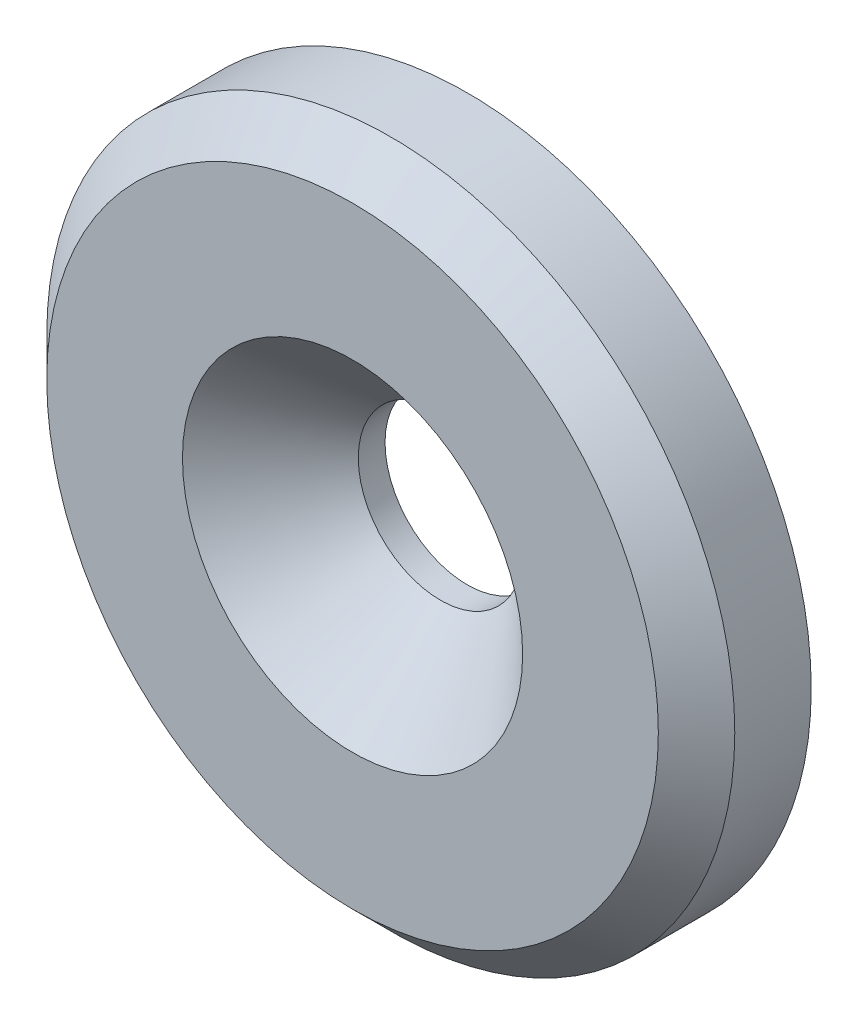
ISO-10303-21;
HEADER;
FILE_DESCRIPTION(('STEP AP214'),'2;1');
FILE_NAME('part.step','',(''),(''),'','','');
FILE_SCHEMA(('AUTOMOTIVE_DESIGN { 1 0 10303 214 1 1 1 1 }'));
ENDSEC;
DATA;
#1=APPLICATION_CONTEXT('core data for automotive mechanical design processes');
#2=APPLICATION_PROTOCOL_DEFINITION('international standard','automotive_design',2000,#1);
#3=PRODUCT_CONTEXT('',#1,'mechanical');
#4=PRODUCT('Part','Part','',(#3));
#5=PRODUCT_RELATED_PRODUCT_CATEGORY('part','',(#4));
#6=PRODUCT_DEFINITION_FORMATION('','',#4);
#7=PRODUCT_DEFINITION_CONTEXT('part definition',#1,'design');
#8=PRODUCT_DEFINITION('design','',#6,#7);
#9=PRODUCT_DEFINITION_SHAPE('','',#8);
#10=(LENGTH_UNIT() NAMED_UNIT(*) SI_UNIT(.MILLI.,.METRE.));
#11=(NAMED_UNIT(*) PLANE_ANGLE_UNIT() SI_UNIT($,.RADIAN.));
#12=(NAMED_UNIT(*) SI_UNIT($,.STERADIAN.) SOLID_ANGLE_UNIT());
#13=UNCERTAINTY_MEASURE_WITH_UNIT(LENGTH_MEASURE(1.E-05),#10,'distance_accuracy_value','');
#14=(GEOMETRIC_REPRESENTATION_CONTEXT(3) GLOBAL_UNCERTAINTY_ASSIGNED_CONTEXT((#13)) GLOBAL_UNIT_ASSIGNED_CONTEXT((#10,
#11,#12)) REPRESENTATION_CONTEXT('',''));
#15=CARTESIAN_POINT('',(0.,0.,0.));
#16=DIRECTION('',(0.,0.,1.));
#17=DIRECTION('',(1.,0.,0.));
#18=AXIS2_PLACEMENT_3D('',#15,#16,#17);
#19=CARTESIAN_POINT('',(0.,0.,0.));
#20=DIRECTION('',(0.,0.,1.));
#21=DIRECTION('',(1.,0.,0.));
#22=AXIS2_PLACEMENT_3D('',#19,#20,#21);
#23=PLANE('',#22);
#24=CARTESIAN_POINT('',(0.,0.,0.));
#25=DIRECTION('',(0.,0.,-1.));
#26=DIRECTION('',(-1.,0.,0.));
#27=AXIS2_PLACEMENT_3D('',#24,#25,#26);
#28=CIRCLE('',#27,9.);
#29=CARTESIAN_POINT('',(-9.,0.,0.));
#30=VERTEX_POINT('',#29);
#31=EDGE_CURVE('E46',#30,#30,#28,.T.);
#32=ORIENTED_EDGE('',*,*,#31,.T.);
#33=EDGE_LOOP('',(#32));
#34=FACE_BOUND('',#33,.T.);
#35=CARTESIAN_POINT('',(0.,0.,0.));
#36=DIRECTION('',(0.,0.,-1.));
#37=DIRECTION('',(-1.,0.,0.));
#38=AXIS2_PLACEMENT_3D('',#35,#36,#37);
#39=CIRCLE('',#38,2.15);
#40=CARTESIAN_POINT('',(-2.15,0.,0.));
#41=VERTEX_POINT('',#40);
#42=EDGE_CURVE('E99',#41,#41,#39,.T.);
#43=ORIENTED_EDGE('',*,*,#42,.F.);
#44=EDGE_LOOP('',(#43));
#45=FACE_BOUND('',#44,.T.);
#46=ADVANCED_FACE('F85',(#34,#45),#23,.F.);
#47=CARTESIAN_POINT('',(9.,0.,3.));
#48=DIRECTION('',(0.,0.,-1.));
#49=DIRECTION('',(-1.,0.,0.));
#50=AXIS2_PLACEMENT_3D('',#47,#48,#49);
#51=PLANE('',#50);
#52=CARTESIAN_POINT('',(0.,0.,3.));
#53=DIRECTION('',(0.,0.,-1.));
#54=DIRECTION('',(-1.,0.,0.));
#55=AXIS2_PLACEMENT_3D('',#52,#53,#54);
#56=CIRCLE('',#55,8.);
#57=CARTESIAN_POINT('',(-8.,0.,3.));
#58=VERTEX_POINT('',#57);
#59=EDGE_CURVE('E91',#58,#58,#56,.T.);
#60=ORIENTED_EDGE('',*,*,#59,.F.);
#61=EDGE_LOOP('',(#60));
#62=FACE_BOUND('',#61,.T.);
#63=CARTESIAN_POINT('',(0.,0.,3.));
#64=DIRECTION('',(0.,0.,-1.));
#65=DIRECTION('',(-1.,0.,0.));
#66=AXIS2_PLACEMENT_3D('',#63,#64,#65);
#67=CIRCLE('',#66,4.44999999999999);
#68=CARTESIAN_POINT('',(-4.44999999999997,0.,3.00000000000003));
#69=VERTEX_POINT('',#68);
#70=EDGE_CURVE('E107',#69,#69,#67,.T.);
#71=ORIENTED_EDGE('',*,*,#70,.T.);
#72=EDGE_LOOP('',(#71));
#73=FACE_BOUND('',#72,.T.);
#74=ADVANCED_FACE('F111',(#62,#73),#51,.F.);
#75=CARTESIAN_POINT('',(0.,0.,3.));
#76=DIRECTION('',(0.,0.,-1.));
#77=DIRECTION('',(-1.,0.,0.));
#78=AXIS2_PLACEMENT_3D('',#75,#76,#77);
#79=CYLINDRICAL_SURFACE('',#78,9.);
#80=ORIENTED_EDGE('',*,*,#31,.F.);
#81=EDGE_LOOP('',(#80));
#82=FACE_BOUND('',#81,.T.);
#83=CARTESIAN_POINT('',(0.,0.,2.));
#84=DIRECTION('',(0.,0.,-1.));
#85=DIRECTION('',(-1.,0.,0.));
#86=AXIS2_PLACEMENT_3D('',#83,#84,#85);
#87=CIRCLE('',#86,9.);
#88=CARTESIAN_POINT('',(-9.,0.,2.));
#89=VERTEX_POINT('',#88);
#90=EDGE_CURVE('E95',#89,#89,#87,.T.);
#91=ORIENTED_EDGE('',*,*,#90,.T.);
#92=EDGE_LOOP('',(#91));
#93=FACE_BOUND('',#92,.T.);
#94=ADVANCED_FACE('F128',(#82,#93),#79,.T.);
#95=CARTESIAN_POINT('',(0.,0.,2.));
#96=DIRECTION('',(0.,0.,-1.));
#97=DIRECTION('',(-1.,0.,0.));
#98=AXIS2_PLACEMENT_3D('',#95,#96,#97);
#99=CONICAL_SURFACE('',#98,9.,0.785398163397449);
#100=ORIENTED_EDGE('',*,*,#59,.T.);
#101=EDGE_LOOP('',(#100));
#102=FACE_BOUND('',#101,.T.);
#103=ORIENTED_EDGE('',*,*,#90,.F.);
#104=EDGE_LOOP('',(#103));
#105=FACE_BOUND('',#104,.T.);
#106=ADVANCED_FACE('F121',(#102,#105),#99,.T.);
#107=CARTESIAN_POINT('',(0.,0.,3.));
#108=DIRECTION('',(0.,0.,-1.));
#109=DIRECTION('',(-1.,0.,0.));
#110=AXIS2_PLACEMENT_3D('',#107,#108,#109);
#111=CYLINDRICAL_SURFACE('',#110,2.15);
#112=ORIENTED_EDGE('',*,*,#42,.T.);
#113=EDGE_LOOP('',(#112));
#114=FACE_BOUND('',#113,.T.);
#115=CARTESIAN_POINT('',(0.,0.,0.700000000000001));
#116=DIRECTION('',(0.,0.,-1.));
#117=DIRECTION('',(-1.,0.,0.));
#118=AXIS2_PLACEMENT_3D('',#115,#116,#117);
#119=CIRCLE('',#118,2.15);
#120=CARTESIAN_POINT('',(-2.14999999999999,0.,0.700000000000015));
#121=VERTEX_POINT('',#120);
#122=EDGE_CURVE('E104',#121,#121,#119,.T.);
#123=ORIENTED_EDGE('',*,*,#122,.F.);
#124=EDGE_LOOP('',(#123));
#125=FACE_BOUND('',#124,.T.);
#126=ADVANCED_FACE('F115',(#114,#125),#111,.F.);
#127=CARTESIAN_POINT('',(0.,0.,3.));
#128=DIRECTION('',(0.,0.,1.));
#129=DIRECTION('',(1.,0.,0.));
#130=AXIS2_PLACEMENT_3D('',#127,#128,#129);
#131=CONICAL_SURFACE('',#130,4.44999999999999,0.785398163397447);
#132=ORIENTED_EDGE('',*,*,#122,.T.);
#133=EDGE_LOOP('',(#132));
#134=FACE_BOUND('',#133,.T.);
#135=ORIENTED_EDGE('',*,*,#70,.F.);
#136=EDGE_LOOP('',(#135));
#137=FACE_BOUND('',#136,.T.);
#138=ADVANCED_FACE('F113',(#134,#137),#131,.F.);
#139=CLOSED_SHELL('',(#46,#74,#94,#106,#126,#138));
#140=MANIFOLD_SOLID_BREP('B6',#139);
#141=ADVANCED_BREP_SHAPE_REPRESENTATION('',(#18,#140),#14);
#142=SHAPE_DEFINITION_REPRESENTATION(#9,#141);
ENDSEC;
END-ISO-10303-21;
